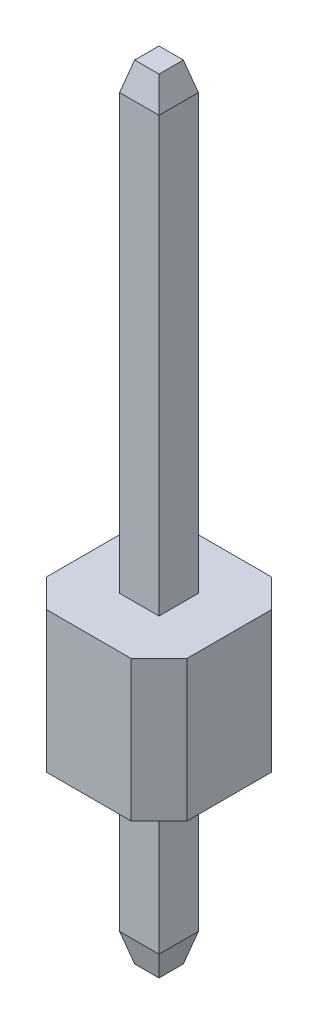
ISO-10303-21;
HEADER;
FILE_DESCRIPTION(('STEP AP214'),'2;1');
FILE_NAME('part.step','',(''),(''),'','','');
FILE_SCHEMA(('AUTOMOTIVE_DESIGN { 1 0 10303 214 1 1 1 1 }'));
ENDSEC;
DATA;
#1=APPLICATION_CONTEXT('core data for automotive mechanical design processes');
#2=APPLICATION_PROTOCOL_DEFINITION('international standard','automotive_design',2000,#1);
#3=PRODUCT_CONTEXT('',#1,'mechanical');
#4=PRODUCT('Part','Part','',(#3));
#5=PRODUCT_RELATED_PRODUCT_CATEGORY('part','',(#4));
#6=PRODUCT_DEFINITION_FORMATION('','',#4);
#7=PRODUCT_DEFINITION_CONTEXT('part definition',#1,'design');
#8=PRODUCT_DEFINITION('design','',#6,#7);
#9=PRODUCT_DEFINITION_SHAPE('','',#8);
#10=(LENGTH_UNIT() NAMED_UNIT(*) SI_UNIT(.MILLI.,.METRE.));
#11=(NAMED_UNIT(*) PLANE_ANGLE_UNIT() SI_UNIT($,.RADIAN.));
#12=(NAMED_UNIT(*) SI_UNIT($,.STERADIAN.) SOLID_ANGLE_UNIT());
#13=UNCERTAINTY_MEASURE_WITH_UNIT(LENGTH_MEASURE(1.E-05),#10,'distance_accuracy_value','');
#14=(GEOMETRIC_REPRESENTATION_CONTEXT(3) GLOBAL_UNCERTAINTY_ASSIGNED_CONTEXT((#13)) GLOBAL_UNIT_ASSIGNED_CONTEXT((#10,
#11,#12)) REPRESENTATION_CONTEXT('',''));
#15=CARTESIAN_POINT('',(0.,0.,0.));
#16=DIRECTION('',(0.,0.,1.));
#17=DIRECTION('',(1.,0.,0.));
#18=AXIS2_PLACEMENT_3D('',#15,#16,#17);
#19=CARTESIAN_POINT('',(-0.35,-3.95,0.35));
#20=DIRECTION('',(-1.,0.,0.));
#21=DIRECTION('',(0.,0.,1.));
#22=AXIS2_PLACEMENT_3D('',#19,#20,#21);
#23=PLANE('',#22);
#24=DIRECTION('',(0.,1.,0.));
#25=VECTOR('',#24,1.);
#26=CARTESIAN_POINT('',(-0.35,-3.95,0.35));
#27=LINE('',#26,#25);
#28=CARTESIAN_POINT('',(-0.35,-3.95,0.35));
#29=VERTEX_POINT('',#28);
#30=CARTESIAN_POINT('',(-0.35,8.95,0.35));
#31=VERTEX_POINT('',#30);
#32=EDGE_CURVE('E62',#29,#31,#27,.T.);
#33=ORIENTED_EDGE('',*,*,#32,.T.);
#34=DIRECTION('',(0.,0.,1.));
#35=VECTOR('',#34,1.);
#36=CARTESIAN_POINT('',(-0.35,8.95,0.35));
#37=LINE('',#36,#35);
#38=CARTESIAN_POINT('',(-0.35,8.95,-0.35));
#39=VERTEX_POINT('',#38);
#40=EDGE_CURVE('E180',#39,#31,#37,.T.);
#41=ORIENTED_EDGE('',*,*,#40,.F.);
#42=DIRECTION('',(0.,1.,0.));
#43=VECTOR('',#42,1.);
#44=CARTESIAN_POINT('',(-0.35,-3.95,-0.35));
#45=LINE('',#44,#43);
#46=CARTESIAN_POINT('',(-0.35,-3.95,-0.35));
#47=VERTEX_POINT('',#46);
#48=EDGE_CURVE('E12',#47,#39,#45,.T.);
#49=ORIENTED_EDGE('',*,*,#48,.F.);
#50=DIRECTION('',(0.,0.,1.));
#51=VECTOR('',#50,1.);
#52=CARTESIAN_POINT('',(-0.35,-3.95,0.35));
#53=LINE('',#52,#51);
#54=EDGE_CURVE('E131',#47,#29,#53,.T.);
#55=ORIENTED_EDGE('',*,*,#54,.T.);
#56=EDGE_LOOP('',(#33,#41,#49,#55));
#57=FACE_BOUND('',#56,.T.);
#58=ADVANCED_FACE('F59',(#57),#23,.T.);
#59=CARTESIAN_POINT('',(0.35,-3.95,-0.35));
#60=DIRECTION('',(0.,0.,-1.));
#61=DIRECTION('',(-1.,0.,0.));
#62=AXIS2_PLACEMENT_3D('',#59,#60,#61);
#63=PLANE('',#62);
#64=ORIENTED_EDGE('',*,*,#48,.T.);
#65=DIRECTION('',(-1.,0.,0.));
#66=VECTOR('',#65,1.);
#67=CARTESIAN_POINT('',(0.35,8.95,-0.35));
#68=LINE('',#67,#66);
#69=CARTESIAN_POINT('',(0.35,8.95,-0.35));
#70=VERTEX_POINT('',#69);
#71=EDGE_CURVE('E155',#70,#39,#68,.T.);
#72=ORIENTED_EDGE('',*,*,#71,.F.);
#73=DIRECTION('',(0.,1.,0.));
#74=VECTOR('',#73,1.);
#75=CARTESIAN_POINT('',(0.35,-3.95,-0.35));
#76=LINE('',#75,#74);
#77=CARTESIAN_POINT('',(0.35,-3.95,-0.35));
#78=VERTEX_POINT('',#77);
#79=EDGE_CURVE('E67',#78,#70,#76,.T.);
#80=ORIENTED_EDGE('',*,*,#79,.F.);
#81=DIRECTION('',(-1.,0.,0.));
#82=VECTOR('',#81,1.);
#83=CARTESIAN_POINT('',(0.35,-3.95,-0.35));
#84=LINE('',#83,#82);
#85=EDGE_CURVE('E152',#78,#47,#84,.T.);
#86=ORIENTED_EDGE('',*,*,#85,.T.);
#87=EDGE_LOOP('',(#64,#72,#80,#86));
#88=FACE_BOUND('',#87,.T.);
#89=ADVANCED_FACE('F220',(#88),#63,.T.);
#90=CARTESIAN_POINT('',(0.35,-3.95,0.35));
#91=DIRECTION('',(1.,0.,0.));
#92=DIRECTION('',(0.,0.,-1.));
#93=AXIS2_PLACEMENT_3D('',#90,#91,#92);
#94=PLANE('',#93);
#95=ORIENTED_EDGE('',*,*,#79,.T.);
#96=DIRECTION('',(0.,0.,-1.));
#97=VECTOR('',#96,1.);
#98=CARTESIAN_POINT('',(0.35,8.95,0.35));
#99=LINE('',#98,#97);
#100=CARTESIAN_POINT('',(0.35,8.95,0.35));
#101=VERTEX_POINT('',#100);
#102=EDGE_CURVE('E158',#101,#70,#99,.T.);
#103=ORIENTED_EDGE('',*,*,#102,.F.);
#104=DIRECTION('',(0.,1.,0.));
#105=VECTOR('',#104,1.);
#106=CARTESIAN_POINT('',(0.35,-3.95,0.35));
#107=LINE('',#106,#105);
#108=CARTESIAN_POINT('',(0.35,-3.95,0.35));
#109=VERTEX_POINT('',#108);
#110=EDGE_CURVE('E151',#109,#101,#107,.T.);
#111=ORIENTED_EDGE('',*,*,#110,.F.);
#112=DIRECTION('',(0.,0.,-1.));
#113=VECTOR('',#112,1.);
#114=CARTESIAN_POINT('',(0.35,-3.95,0.35));
#115=LINE('',#114,#113);
#116=EDGE_CURVE('E143',#109,#78,#115,.T.);
#117=ORIENTED_EDGE('',*,*,#116,.T.);
#118=EDGE_LOOP('',(#95,#103,#111,#117));
#119=FACE_BOUND('',#118,.T.);
#120=ADVANCED_FACE('F166',(#119),#94,.T.);
#121=CARTESIAN_POINT('',(0.35,-3.95,0.35));
#122=DIRECTION('',(0.,0.,1.));
#123=DIRECTION('',(1.,0.,0.));
#124=AXIS2_PLACEMENT_3D('',#121,#122,#123);
#125=PLANE('',#124);
#126=ORIENTED_EDGE('',*,*,#110,.T.);
#127=DIRECTION('',(1.,0.,0.));
#128=VECTOR('',#127,1.);
#129=CARTESIAN_POINT('',(0.35,8.95,0.35));
#130=LINE('',#129,#128);
#131=EDGE_CURVE('E148',#31,#101,#130,.T.);
#132=ORIENTED_EDGE('',*,*,#131,.F.);
#133=ORIENTED_EDGE('',*,*,#32,.F.);
#134=DIRECTION('',(1.,0.,0.));
#135=VECTOR('',#134,1.);
#136=CARTESIAN_POINT('',(0.35,-3.95,0.35));
#137=LINE('',#136,#135);
#138=EDGE_CURVE('E139',#29,#109,#137,.T.);
#139=ORIENTED_EDGE('',*,*,#138,.T.);
#140=EDGE_LOOP('',(#126,#132,#133,#139));
#141=FACE_BOUND('',#140,.T.);
#142=ADVANCED_FACE('F146',(#141),#125,.T.);
#143=CARTESIAN_POINT('',(0.35,8.95,-0.35));
#144=DIRECTION('',(0.,0.258819045102521,-0.965925826289068));
#145=DIRECTION('',(0.,0.965925826289068,0.258819045102521));
#146=AXIS2_PLACEMENT_3D('',#143,#144,#145);
#147=PLANE('',#146);
#148=ORIENTED_EDGE('',*,*,#71,.T.);
#149=DIRECTION('',(-0.250562807085732,-0.935113126531029,-0.250562807085732));
#150=VECTOR('',#149,1.);
#151=CARTESIAN_POINT('',(-0.35,8.95,-0.35));
#152=LINE('',#151,#150);
#153=CARTESIAN_POINT('',(-0.216025403784438,9.45,-0.216025403784438));
#154=VERTEX_POINT('',#153);
#155=EDGE_CURVE('E186',#154,#39,#152,.T.);
#156=ORIENTED_EDGE('',*,*,#155,.F.);
#157=DIRECTION('',(1.,0.,0.));
#158=VECTOR('',#157,1.);
#159=CARTESIAN_POINT('',(0.35,9.45,-0.216025403784438));
#160=LINE('',#159,#158);
#161=CARTESIAN_POINT('',(0.216025403784438,9.45,-0.216025403784438));
#162=VERTEX_POINT('',#161);
#163=EDGE_CURVE('E135',#162,#154,#160,.F.);
#164=ORIENTED_EDGE('',*,*,#163,.F.);
#165=DIRECTION('',(0.250562807085732,-0.935113126531029,-0.250562807085732));
#166=VECTOR('',#165,1.);
#167=CARTESIAN_POINT('',(0.35,8.95,-0.35));
#168=LINE('',#167,#166);
#169=EDGE_CURVE('E184',#162,#70,#168,.T.);
#170=ORIENTED_EDGE('',*,*,#169,.T.);
#171=EDGE_LOOP('',(#148,#156,#164,#170));
#172=FACE_BOUND('',#171,.T.);
#173=ADVANCED_FACE('F222',(#172),#147,.T.);
#174=CARTESIAN_POINT('',(-0.35,8.95,-0.35));
#175=DIRECTION('',(-0.965925826289068,0.258819045102521,0.));
#176=DIRECTION('',(-0.258819045102521,-0.965925826289068,0.));
#177=AXIS2_PLACEMENT_3D('',#174,#175,#176);
#178=PLANE('',#177);
#179=ORIENTED_EDGE('',*,*,#40,.T.);
#180=DIRECTION('',(-0.250562807085732,-0.935113126531029,0.250562807085732));
#181=VECTOR('',#180,1.);
#182=CARTESIAN_POINT('',(-0.35,8.95,0.35));
#183=LINE('',#182,#181);
#184=CARTESIAN_POINT('',(-0.216025403784438,9.45,0.216025403784438));
#185=VERTEX_POINT('',#184);
#186=EDGE_CURVE('E179',#185,#31,#183,.T.);
#187=ORIENTED_EDGE('',*,*,#186,.F.);
#188=DIRECTION('',(0.,0.,-1.));
#189=VECTOR('',#188,1.);
#190=CARTESIAN_POINT('',(-0.216025403784438,9.45,-0.35));
#191=LINE('',#190,#189);
#192=EDGE_CURVE('E193',#154,#185,#191,.F.);
#193=ORIENTED_EDGE('',*,*,#192,.F.);
#194=ORIENTED_EDGE('',*,*,#155,.T.);
#195=EDGE_LOOP('',(#179,#187,#193,#194));
#196=FACE_BOUND('',#195,.T.);
#197=ADVANCED_FACE('F226',(#196),#178,.T.);
#198=CARTESIAN_POINT('',(-0.35,8.95,0.35));
#199=DIRECTION('',(0.,0.258819045102521,0.965925826289068));
#200=DIRECTION('',(0.,-0.965925826289068,0.258819045102521));
#201=AXIS2_PLACEMENT_3D('',#198,#199,#200);
#202=PLANE('',#201);
#203=ORIENTED_EDGE('',*,*,#131,.T.);
#204=DIRECTION('',(0.250562807085732,-0.935113126531029,0.250562807085732));
#205=VECTOR('',#204,1.);
#206=CARTESIAN_POINT('',(0.35,8.95,0.35));
#207=LINE('',#206,#205);
#208=CARTESIAN_POINT('',(0.216025403784438,9.45,0.216025403784438));
#209=VERTEX_POINT('',#208);
#210=EDGE_CURVE('E176',#209,#101,#207,.T.);
#211=ORIENTED_EDGE('',*,*,#210,.F.);
#212=DIRECTION('',(-1.,0.,0.));
#213=VECTOR('',#212,1.);
#214=CARTESIAN_POINT('',(-0.35,9.45,0.216025403784438));
#215=LINE('',#214,#213);
#216=EDGE_CURVE('E195',#185,#209,#215,.F.);
#217=ORIENTED_EDGE('',*,*,#216,.F.);
#218=ORIENTED_EDGE('',*,*,#186,.T.);
#219=EDGE_LOOP('',(#203,#211,#217,#218));
#220=FACE_BOUND('',#219,.T.);
#221=ADVANCED_FACE('F174',(#220),#202,.T.);
#222=CARTESIAN_POINT('',(0.35,8.95,0.35));
#223=DIRECTION('',(0.965925826289068,0.258819045102521,0.));
#224=DIRECTION('',(-0.258819045102521,0.965925826289068,0.));
#225=AXIS2_PLACEMENT_3D('',#222,#223,#224);
#226=PLANE('',#225);
#227=ORIENTED_EDGE('',*,*,#102,.T.);
#228=ORIENTED_EDGE('',*,*,#169,.F.);
#229=DIRECTION('',(0.,0.,1.));
#230=VECTOR('',#229,1.);
#231=CARTESIAN_POINT('',(0.216025403784438,9.45,0.35));
#232=LINE('',#231,#230);
#233=EDGE_CURVE('E183',#209,#162,#232,.F.);
#234=ORIENTED_EDGE('',*,*,#233,.F.);
#235=ORIENTED_EDGE('',*,*,#210,.T.);
#236=EDGE_LOOP('',(#227,#228,#234,#235));
#237=FACE_BOUND('',#236,.T.);
#238=ADVANCED_FACE('F182',(#237),#226,.T.);
#239=CARTESIAN_POINT('',(0.,9.45,0.));
#240=DIRECTION('',(0.,1.,0.));
#241=DIRECTION('',(0.,0.,1.));
#242=AXIS2_PLACEMENT_3D('',#239,#240,#241);
#243=PLANE('',#242);
#244=ORIENTED_EDGE('',*,*,#163,.T.);
#245=ORIENTED_EDGE('',*,*,#192,.T.);
#246=ORIENTED_EDGE('',*,*,#216,.T.);
#247=ORIENTED_EDGE('',*,*,#233,.T.);
#248=EDGE_LOOP('',(#244,#245,#246,#247));
#249=FACE_BOUND('',#248,.T.);
#250=ADVANCED_FACE('F225',(#249),#243,.T.);
#251=CARTESIAN_POINT('',(0.35,-3.95,0.35));
#252=DIRECTION('',(0.,-0.258819045102521,0.965925826289068));
#253=DIRECTION('',(0.,-0.965925826289068,-0.258819045102521));
#254=AXIS2_PLACEMENT_3D('',#251,#252,#253);
#255=PLANE('',#254);
#256=ORIENTED_EDGE('',*,*,#138,.F.);
#257=DIRECTION('',(-0.250562807085732,0.935113126531029,0.250562807085732));
#258=VECTOR('',#257,1.);
#259=CARTESIAN_POINT('',(-0.35,-3.95,0.35));
#260=LINE('',#259,#258);
#261=CARTESIAN_POINT('',(-0.216025403784439,-4.45,0.216025403784438));
#262=VERTEX_POINT('',#261);
#263=EDGE_CURVE('E127',#262,#29,#260,.T.);
#264=ORIENTED_EDGE('',*,*,#263,.F.);
#265=DIRECTION('',(1.,0.,0.));
#266=VECTOR('',#265,1.);
#267=CARTESIAN_POINT('',(0.35,-4.45,0.216025403784438));
#268=LINE('',#267,#266);
#269=CARTESIAN_POINT('',(0.216025403784438,-4.45,0.216025403784438));
#270=VERTEX_POINT('',#269);
#271=EDGE_CURVE('E207',#270,#262,#268,.F.);
#272=ORIENTED_EDGE('',*,*,#271,.F.);
#273=DIRECTION('',(0.250562807085732,0.935113126531029,0.250562807085732));
#274=VECTOR('',#273,1.);
#275=CARTESIAN_POINT('',(0.35,-3.95,0.35));
#276=LINE('',#275,#274);
#277=EDGE_CURVE('E75',#270,#109,#276,.T.);
#278=ORIENTED_EDGE('',*,*,#277,.T.);
#279=EDGE_LOOP('',(#256,#264,#272,#278));
#280=FACE_BOUND('',#279,.T.);
#281=ADVANCED_FACE('F141',(#280),#255,.T.);
#282=CARTESIAN_POINT('',(-0.35,-3.95,0.35));
#283=DIRECTION('',(-0.965925826289068,-0.258819045102521,0.));
#284=DIRECTION('',(0.258819045102521,-0.965925826289068,0.));
#285=AXIS2_PLACEMENT_3D('',#282,#283,#284);
#286=PLANE('',#285);
#287=ORIENTED_EDGE('',*,*,#54,.F.);
#288=DIRECTION('',(-0.250562807085732,0.935113126531029,-0.250562807085732));
#289=VECTOR('',#288,1.);
#290=CARTESIAN_POINT('',(-0.35,-3.95,-0.35));
#291=LINE('',#290,#289);
#292=CARTESIAN_POINT('',(-0.216025403784439,-4.45,-0.216025403784438));
#293=VERTEX_POINT('',#292);
#294=EDGE_CURVE('E136',#293,#47,#291,.T.);
#295=ORIENTED_EDGE('',*,*,#294,.F.);
#296=DIRECTION('',(0.,0.,1.));
#297=VECTOR('',#296,1.);
#298=CARTESIAN_POINT('',(-0.216025403784439,-4.45,0.35));
#299=LINE('',#298,#297);
#300=EDGE_CURVE('E133',#262,#293,#299,.F.);
#301=ORIENTED_EDGE('',*,*,#300,.F.);
#302=ORIENTED_EDGE('',*,*,#263,.T.);
#303=EDGE_LOOP('',(#287,#295,#301,#302));
#304=FACE_BOUND('',#303,.T.);
#305=ADVANCED_FACE('F128',(#304),#286,.T.);
#306=CARTESIAN_POINT('',(-0.35,-3.95,-0.35));
#307=DIRECTION('',(0.,-0.258819045102521,-0.965925826289068));
#308=DIRECTION('',(0.,0.965925826289068,-0.258819045102521));
#309=AXIS2_PLACEMENT_3D('',#306,#307,#308);
#310=PLANE('',#309);
#311=ORIENTED_EDGE('',*,*,#85,.F.);
#312=DIRECTION('',(0.250562807085732,0.935113126531029,-0.250562807085732));
#313=VECTOR('',#312,1.);
#314=CARTESIAN_POINT('',(0.35,-3.95,-0.35));
#315=LINE('',#314,#313);
#316=CARTESIAN_POINT('',(0.216025403784438,-4.45,-0.216025403784439));
#317=VERTEX_POINT('',#316);
#318=EDGE_CURVE('E210',#317,#78,#315,.T.);
#319=ORIENTED_EDGE('',*,*,#318,.F.);
#320=DIRECTION('',(-1.,0.,0.));
#321=VECTOR('',#320,1.);
#322=CARTESIAN_POINT('',(-0.35,-4.45,-0.216025403784438));
#323=LINE('',#322,#321);
#324=EDGE_CURVE('E204',#293,#317,#323,.F.);
#325=ORIENTED_EDGE('',*,*,#324,.F.);
#326=ORIENTED_EDGE('',*,*,#294,.T.);
#327=EDGE_LOOP('',(#311,#319,#325,#326));
#328=FACE_BOUND('',#327,.T.);
#329=ADVANCED_FACE('F266',(#328),#310,.T.);
#330=CARTESIAN_POINT('',(0.35,-3.95,-0.35));
#331=DIRECTION('',(0.965925826289068,-0.258819045102521,0.));
#332=DIRECTION('',(0.258819045102521,0.965925826289068,0.));
#333=AXIS2_PLACEMENT_3D('',#330,#331,#332);
#334=PLANE('',#333);
#335=ORIENTED_EDGE('',*,*,#116,.F.);
#336=ORIENTED_EDGE('',*,*,#277,.F.);
#337=DIRECTION('',(0.,0.,-1.));
#338=VECTOR('',#337,1.);
#339=CARTESIAN_POINT('',(0.216025403784438,-4.45,-0.35));
#340=LINE('',#339,#338);
#341=EDGE_CURVE('E202',#317,#270,#340,.F.);
#342=ORIENTED_EDGE('',*,*,#341,.F.);
#343=ORIENTED_EDGE('',*,*,#318,.T.);
#344=EDGE_LOOP('',(#335,#336,#342,#343));
#345=FACE_BOUND('',#344,.T.);
#346=ADVANCED_FACE('F216',(#345),#334,.T.);
#347=CARTESIAN_POINT('',(0.,-4.45,0.));
#348=DIRECTION('',(0.,-1.,0.));
#349=DIRECTION('',(0.,0.,-1.));
#350=AXIS2_PLACEMENT_3D('',#347,#348,#349);
#351=PLANE('',#350);
#352=ORIENTED_EDGE('',*,*,#271,.T.);
#353=ORIENTED_EDGE('',*,*,#300,.T.);
#354=ORIENTED_EDGE('',*,*,#324,.T.);
#355=ORIENTED_EDGE('',*,*,#341,.T.);
#356=EDGE_LOOP('',(#352,#353,#354,#355));
#357=FACE_BOUND('',#356,.T.);
#358=ADVANCED_FACE('F281',(#357),#351,.T.);
#359=CLOSED_SHELL('',(#58,#89,#120,#142,#173,#197,#221,#238,#250,#281,#305,#329,#346,#358));
#360=MANIFOLD_SOLID_BREP('B2',#359);
#361=CARTESIAN_POINT('',(1.25,1.25,-1.25));
#362=DIRECTION('',(-1.,0.,0.));
#363=DIRECTION('',(0.,0.,1.));
#364=AXIS2_PLACEMENT_3D('',#361,#362,#363);
#365=PLANE('',#364);
#366=DIRECTION('',(0.,0.,-1.));
#367=VECTOR('',#366,1.);
#368=CARTESIAN_POINT('',(1.25,-1.25,-1.25));
#369=LINE('',#368,#367);
#370=CARTESIAN_POINT('',(1.25,-1.25,0.75));
#371=VERTEX_POINT('',#370);
#372=CARTESIAN_POINT('',(1.25,-1.25,-0.749999999999999));
#373=VERTEX_POINT('',#372);
#374=EDGE_CURVE('E487',#371,#373,#369,.T.);
#375=ORIENTED_EDGE('',*,*,#374,.T.);
#376=DIRECTION('',(0.,1.,0.));
#377=VECTOR('',#376,1.);
#378=CARTESIAN_POINT('',(1.25,1.25,-0.749999999999999));
#379=LINE('',#378,#377);
#380=CARTESIAN_POINT('',(1.25,1.25,-0.749999999999999));
#381=VERTEX_POINT('',#380);
#382=EDGE_CURVE('E57',#373,#381,#379,.T.);
#383=ORIENTED_EDGE('',*,*,#382,.T.);
#384=DIRECTION('',(0.,0.,-1.));
#385=VECTOR('',#384,1.);
#386=CARTESIAN_POINT('',(1.25,1.25,-1.25));
#387=LINE('',#386,#385);
#388=CARTESIAN_POINT('',(1.25,1.25,0.75));
#389=VERTEX_POINT('',#388);
#390=EDGE_CURVE('E440',#389,#381,#387,.T.);
#391=ORIENTED_EDGE('',*,*,#390,.F.);
#392=DIRECTION('',(0.,-1.,0.));
#393=VECTOR('',#392,1.);
#394=CARTESIAN_POINT('',(1.25,1.25,0.75));
#395=LINE('',#394,#393);
#396=EDGE_CURVE('E353',#389,#371,#395,.T.);
#397=ORIENTED_EDGE('',*,*,#396,.T.);
#398=EDGE_LOOP('',(#375,#383,#391,#397));
#399=FACE_BOUND('',#398,.T.);
#400=ADVANCED_FACE('F343',(#399),#365,.F.);
#401=CARTESIAN_POINT('',(-1.25,1.25,-1.25));
#402=DIRECTION('',(0.,0.,1.));
#403=DIRECTION('',(1.,0.,0.));
#404=AXIS2_PLACEMENT_3D('',#401,#402,#403);
#405=PLANE('',#404);
#406=DIRECTION('',(-1.,0.,0.));
#407=VECTOR('',#406,1.);
#408=CARTESIAN_POINT('',(-1.25,-1.25,-1.25));
#409=LINE('',#408,#407);
#410=CARTESIAN_POINT('',(0.749999999999997,-1.25,-1.25));
#411=VERTEX_POINT('',#410);
#412=CARTESIAN_POINT('',(-0.749999999999999,-1.25,-1.25));
#413=VERTEX_POINT('',#412);
#414=EDGE_CURVE('E447',#411,#413,#409,.T.);
#415=ORIENTED_EDGE('',*,*,#414,.T.);
#416=DIRECTION('',(0.,1.,0.));
#417=VECTOR('',#416,1.);
#418=CARTESIAN_POINT('',(-0.749999999999999,1.25,-1.25));
#419=LINE('',#418,#417);
#420=CARTESIAN_POINT('',(-0.749999999999999,1.25,-1.25));
#421=VERTEX_POINT('',#420);
#422=EDGE_CURVE('E360',#413,#421,#419,.T.);
#423=ORIENTED_EDGE('',*,*,#422,.T.);
#424=DIRECTION('',(-1.,0.,0.));
#425=VECTOR('',#424,1.);
#426=CARTESIAN_POINT('',(-1.25,1.25,-1.25));
#427=LINE('',#426,#425);
#428=CARTESIAN_POINT('',(0.749999999999997,1.25,-1.25));
#429=VERTEX_POINT('',#428);
#430=EDGE_CURVE('E445',#429,#421,#427,.T.);
#431=ORIENTED_EDGE('',*,*,#430,.F.);
#432=DIRECTION('',(0.,-1.,0.));
#433=VECTOR('',#432,1.);
#434=CARTESIAN_POINT('',(0.749999999999997,1.25,-1.25));
#435=LINE('',#434,#433);
#436=EDGE_CURVE('E476',#429,#411,#435,.T.);
#437=ORIENTED_EDGE('',*,*,#436,.T.);
#438=EDGE_LOOP('',(#415,#423,#431,#437));
#439=FACE_BOUND('',#438,.T.);
#440=ADVANCED_FACE('F512',(#439),#405,.F.);
#441=CARTESIAN_POINT('',(-1.25,1.25,-1.25));
#442=DIRECTION('',(1.,0.,0.));
#443=DIRECTION('',(0.,0.,-1.));
#444=AXIS2_PLACEMENT_3D('',#441,#442,#443);
#445=PLANE('',#444);
#446=DIRECTION('',(0.,0.,1.));
#447=VECTOR('',#446,1.);
#448=CARTESIAN_POINT('',(-1.25,-1.25,-1.25));
#449=LINE('',#448,#447);
#450=CARTESIAN_POINT('',(-1.25,-1.25,-0.75));
#451=VERTEX_POINT('',#450);
#452=CARTESIAN_POINT('',(-1.25,-1.25,0.749999999999998));
#453=VERTEX_POINT('',#452);
#454=EDGE_CURVE('E441',#451,#453,#449,.T.);
#455=ORIENTED_EDGE('',*,*,#454,.T.);
#456=DIRECTION('',(0.,1.,0.));
#457=VECTOR('',#456,1.);
#458=CARTESIAN_POINT('',(-1.25,1.25,0.749999999999998));
#459=LINE('',#458,#457);
#460=CARTESIAN_POINT('',(-1.25,1.25,0.749999999999998));
#461=VERTEX_POINT('',#460);
#462=EDGE_CURVE('E416',#453,#461,#459,.T.);
#463=ORIENTED_EDGE('',*,*,#462,.T.);
#464=DIRECTION('',(0.,0.,1.));
#465=VECTOR('',#464,1.);
#466=CARTESIAN_POINT('',(-1.25,1.25,-1.25));
#467=LINE('',#466,#465);
#468=CARTESIAN_POINT('',(-1.25,1.25,-0.75));
#469=VERTEX_POINT('',#468);
#470=EDGE_CURVE('E498',#469,#461,#467,.T.);
#471=ORIENTED_EDGE('',*,*,#470,.F.);
#472=DIRECTION('',(0.,-1.,0.));
#473=VECTOR('',#472,1.);
#474=CARTESIAN_POINT('',(-1.25,1.25,-0.75));
#475=LINE('',#474,#473);
#476=EDGE_CURVE('E422',#469,#451,#475,.T.);
#477=ORIENTED_EDGE('',*,*,#476,.T.);
#478=EDGE_LOOP('',(#455,#463,#471,#477));
#479=FACE_BOUND('',#478,.T.);
#480=ADVANCED_FACE('F511',(#479),#445,.F.);
#481=CARTESIAN_POINT('',(-1.25,1.25,1.25));
#482=DIRECTION('',(0.,0.,-1.));
#483=DIRECTION('',(-1.,0.,0.));
#484=AXIS2_PLACEMENT_3D('',#481,#482,#483);
#485=PLANE('',#484);
#486=DIRECTION('',(1.,0.,0.));
#487=VECTOR('',#486,1.);
#488=CARTESIAN_POINT('',(-1.25,1.25,1.25));
#489=LINE('',#488,#487);
#490=CARTESIAN_POINT('',(-0.750000000000001,1.25,1.25));
#491=VERTEX_POINT('',#490);
#492=CARTESIAN_POINT('',(0.749999999999998,1.25,1.25));
#493=VERTEX_POINT('',#492);
#494=EDGE_CURVE('E432',#491,#493,#489,.T.);
#495=ORIENTED_EDGE('',*,*,#494,.F.);
#496=DIRECTION('',(0.,-1.,0.));
#497=VECTOR('',#496,1.);
#498=CARTESIAN_POINT('',(-0.750000000000001,1.25,1.25));
#499=LINE('',#498,#497);
#500=CARTESIAN_POINT('',(-0.750000000000001,-1.25,1.25));
#501=VERTEX_POINT('',#500);
#502=EDGE_CURVE('E415',#491,#501,#499,.T.);
#503=ORIENTED_EDGE('',*,*,#502,.T.);
#504=DIRECTION('',(1.,0.,0.));
#505=VECTOR('',#504,1.);
#506=CARTESIAN_POINT('',(-1.25,-1.25,1.25));
#507=LINE('',#506,#505);
#508=CARTESIAN_POINT('',(0.749999999999998,-1.25,1.25));
#509=VERTEX_POINT('',#508);
#510=EDGE_CURVE('E429',#501,#509,#507,.T.);
#511=ORIENTED_EDGE('',*,*,#510,.T.);
#512=DIRECTION('',(0.,1.,0.));
#513=VECTOR('',#512,1.);
#514=CARTESIAN_POINT('',(0.749999999999998,1.25,1.25));
#515=LINE('',#514,#513);
#516=EDGE_CURVE('E435',#509,#493,#515,.T.);
#517=ORIENTED_EDGE('',*,*,#516,.T.);
#518=EDGE_LOOP('',(#495,#503,#511,#517));
#519=FACE_BOUND('',#518,.T.);
#520=ADVANCED_FACE('F428',(#519),#485,.F.);
#521=CARTESIAN_POINT('',(0.,1.25,0.));
#522=DIRECTION('',(0.,1.,0.));
#523=DIRECTION('',(0.,0.,1.));
#524=AXIS2_PLACEMENT_3D('',#521,#522,#523);
#525=PLANE('',#524);
#526=ORIENTED_EDGE('',*,*,#470,.T.);
#527=DIRECTION('',(-0.707106781186546,0.,-0.707106781186549));
#528=VECTOR('',#527,1.);
#529=CARTESIAN_POINT('',(-1.,1.25,0.999999999999999));
#530=LINE('',#529,#528);
#531=EDGE_CURVE('E473',#461,#491,#530,.F.);
#532=ORIENTED_EDGE('',*,*,#531,.T.);
#533=ORIENTED_EDGE('',*,*,#494,.T.);
#534=DIRECTION('',(-0.707106781186548,0.,0.707106781186547));
#535=VECTOR('',#534,1.);
#536=CARTESIAN_POINT('',(0.999999999999998,1.25,1.));
#537=LINE('',#536,#535);
#538=EDGE_CURVE('E465',#493,#389,#537,.F.);
#539=ORIENTED_EDGE('',*,*,#538,.T.);
#540=ORIENTED_EDGE('',*,*,#390,.T.);
#541=DIRECTION('',(0.707106781186547,0.,0.707106781186548));
#542=VECTOR('',#541,1.);
#543=CARTESIAN_POINT('',(0.999999999999999,1.25,-0.999999999999998));
#544=LINE('',#543,#542);
#545=EDGE_CURVE('E367',#381,#429,#544,.F.);
#546=ORIENTED_EDGE('',*,*,#545,.T.);
#547=ORIENTED_EDGE('',*,*,#430,.T.);
#548=DIRECTION('',(0.707106781186549,0.,-0.707106781186546));
#549=VECTOR('',#548,1.);
#550=CARTESIAN_POINT('',(-0.999999999999999,1.25,-1.));
#551=LINE('',#550,#549);
#552=EDGE_CURVE('E470',#421,#469,#551,.F.);
#553=ORIENTED_EDGE('',*,*,#552,.T.);
#554=EDGE_LOOP('',(#526,#532,#533,#539,#540,#546,#547,#553));
#555=FACE_BOUND('',#554,.T.);
#556=ADVANCED_FACE('F504',(#555),#525,.T.);
#557=CARTESIAN_POINT('',(0.,-1.25,0.));
#558=DIRECTION('',(0.,1.,0.));
#559=DIRECTION('',(0.,0.,1.));
#560=AXIS2_PLACEMENT_3D('',#557,#558,#559);
#561=PLANE('',#560);
#562=ORIENTED_EDGE('',*,*,#510,.F.);
#563=DIRECTION('',(0.707106781186546,0.,0.707106781186549));
#564=VECTOR('',#563,1.);
#565=CARTESIAN_POINT('',(-0.750000000000001,-1.25,1.25));
#566=LINE('',#565,#564);
#567=EDGE_CURVE('E411',#501,#453,#566,.F.);
#568=ORIENTED_EDGE('',*,*,#567,.T.);
#569=ORIENTED_EDGE('',*,*,#454,.F.);
#570=DIRECTION('',(-0.707106781186549,0.,0.707106781186546));
#571=VECTOR('',#570,1.);
#572=CARTESIAN_POINT('',(-1.25,-1.25,-0.75));
#573=LINE('',#572,#571);
#574=EDGE_CURVE('E423',#451,#413,#573,.F.);
#575=ORIENTED_EDGE('',*,*,#574,.T.);
#576=ORIENTED_EDGE('',*,*,#414,.F.);
#577=DIRECTION('',(-0.707106781186547,0.,-0.707106781186548));
#578=VECTOR('',#577,1.);
#579=CARTESIAN_POINT('',(0.749999999999997,-1.25,-1.25));
#580=LINE('',#579,#578);
#581=EDGE_CURVE('E455',#411,#373,#580,.F.);
#582=ORIENTED_EDGE('',*,*,#581,.T.);
#583=ORIENTED_EDGE('',*,*,#374,.F.);
#584=DIRECTION('',(0.707106781186548,0.,-0.707106781186547));
#585=VECTOR('',#584,1.);
#586=CARTESIAN_POINT('',(1.25,-1.25,0.75));
#587=LINE('',#586,#585);
#588=EDGE_CURVE('E434',#371,#509,#587,.F.);
#589=ORIENTED_EDGE('',*,*,#588,.T.);
#590=EDGE_LOOP('',(#562,#568,#569,#575,#576,#582,#583,#589));
#591=FACE_BOUND('',#590,.T.);
#592=ADVANCED_FACE('F437',(#591),#561,.F.);
#593=CARTESIAN_POINT('',(-0.750000000000001,1.25,1.25));
#594=DIRECTION('',(0.707106781186549,0.,-0.707106781186546));
#595=DIRECTION('',(0.,-1.,0.));
#596=AXIS2_PLACEMENT_3D('',#593,#594,#595);
#597=PLANE('',#596);
#598=ORIENTED_EDGE('',*,*,#531,.F.);
#599=ORIENTED_EDGE('',*,*,#462,.F.);
#600=ORIENTED_EDGE('',*,*,#567,.F.);
#601=ORIENTED_EDGE('',*,*,#502,.F.);
#602=EDGE_LOOP('',(#598,#599,#600,#601));
#603=FACE_BOUND('',#602,.T.);
#604=ADVANCED_FACE('F414',(#603),#597,.F.);
#605=CARTESIAN_POINT('',(-1.25,1.25,-0.75));
#606=DIRECTION('',(0.707106781186546,0.,0.707106781186549));
#607=DIRECTION('',(0.,-1.,0.));
#608=AXIS2_PLACEMENT_3D('',#605,#606,#607);
#609=PLANE('',#608);
#610=ORIENTED_EDGE('',*,*,#552,.F.);
#611=ORIENTED_EDGE('',*,*,#422,.F.);
#612=ORIENTED_EDGE('',*,*,#574,.F.);
#613=ORIENTED_EDGE('',*,*,#476,.F.);
#614=EDGE_LOOP('',(#610,#611,#612,#613));
#615=FACE_BOUND('',#614,.T.);
#616=ADVANCED_FACE('F509',(#615),#609,.F.);
#617=CARTESIAN_POINT('',(0.749999999999997,1.25,-1.25));
#618=DIRECTION('',(-0.707106781186548,0.,0.707106781186547));
#619=DIRECTION('',(0.,-1.,0.));
#620=AXIS2_PLACEMENT_3D('',#617,#618,#619);
#621=PLANE('',#620);
#622=ORIENTED_EDGE('',*,*,#545,.F.);
#623=ORIENTED_EDGE('',*,*,#382,.F.);
#624=ORIENTED_EDGE('',*,*,#581,.F.);
#625=ORIENTED_EDGE('',*,*,#436,.F.);
#626=EDGE_LOOP('',(#622,#623,#624,#625));
#627=FACE_BOUND('',#626,.T.);
#628=ADVANCED_FACE('F514',(#627),#621,.F.);
#629=CARTESIAN_POINT('',(1.25,1.25,0.75));
#630=DIRECTION('',(-0.707106781186547,0.,-0.707106781186548));
#631=DIRECTION('',(0.,-1.,0.));
#632=AXIS2_PLACEMENT_3D('',#629,#630,#631);
#633=PLANE('',#632);
#634=ORIENTED_EDGE('',*,*,#538,.F.);
#635=ORIENTED_EDGE('',*,*,#516,.F.);
#636=ORIENTED_EDGE('',*,*,#588,.F.);
#637=ORIENTED_EDGE('',*,*,#396,.F.);
#638=EDGE_LOOP('',(#634,#635,#636,#637));
#639=FACE_BOUND('',#638,.T.);
#640=ADVANCED_FACE('F346',(#639),#633,.F.);
#641=CLOSED_SHELL('',(#400,#440,#480,#520,#556,#592,#604,#616,#628,#640));
#642=MANIFOLD_SOLID_BREP('B6',#641);
#643=ADVANCED_BREP_SHAPE_REPRESENTATION('',(#18,#360,#642),#14);
#644=SHAPE_DEFINITION_REPRESENTATION(#9,#643);
ENDSEC;
END-ISO-10303-21;
